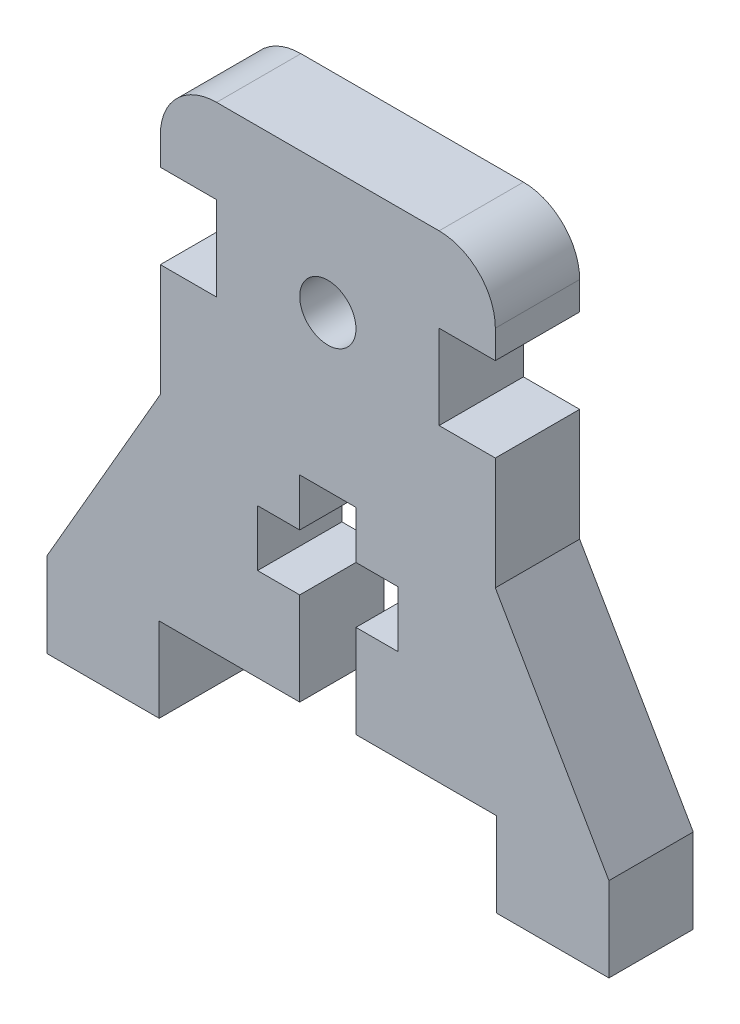
ISO-10303-21;
HEADER;
FILE_DESCRIPTION(('STEP AP214'),'2;1');
FILE_NAME('part.step','',(''),(''),'','','');
FILE_SCHEMA(('AUTOMOTIVE_DESIGN { 1 0 10303 214 1 1 1 1 }'));
ENDSEC;
DATA;
#1=APPLICATION_CONTEXT('core data for automotive mechanical design processes');
#2=APPLICATION_PROTOCOL_DEFINITION('international standard','automotive_design',2000,#1);
#3=PRODUCT_CONTEXT('',#1,'mechanical');
#4=PRODUCT('Part','Part','',(#3));
#5=PRODUCT_RELATED_PRODUCT_CATEGORY('part','',(#4));
#6=PRODUCT_DEFINITION_FORMATION('','',#4);
#7=PRODUCT_DEFINITION_CONTEXT('part definition',#1,'design');
#8=PRODUCT_DEFINITION('design','',#6,#7);
#9=PRODUCT_DEFINITION_SHAPE('','',#8);
#10=(LENGTH_UNIT() NAMED_UNIT(*) SI_UNIT(.MILLI.,.METRE.));
#11=(NAMED_UNIT(*) PLANE_ANGLE_UNIT() SI_UNIT($,.RADIAN.));
#12=(NAMED_UNIT(*) SI_UNIT($,.STERADIAN.) SOLID_ANGLE_UNIT());
#13=UNCERTAINTY_MEASURE_WITH_UNIT(LENGTH_MEASURE(1.E-05),#10,'distance_accuracy_value','');
#14=(GEOMETRIC_REPRESENTATION_CONTEXT(3) GLOBAL_UNCERTAINTY_ASSIGNED_CONTEXT((#13)) GLOBAL_UNIT_ASSIGNED_CONTEXT((#10,
#11,#12)) REPRESENTATION_CONTEXT('',''));
#15=CARTESIAN_POINT('',(0.,0.,0.));
#16=DIRECTION('',(0.,0.,1.));
#17=DIRECTION('',(1.,0.,0.));
#18=AXIS2_PLACEMENT_3D('',#15,#16,#17);
#19=CARTESIAN_POINT('',(-50.,0.,15.));
#20=DIRECTION('',(0.,1.,0.));
#21=DIRECTION('',(0.,0.,1.));
#22=AXIS2_PLACEMENT_3D('',#19,#20,#21);
#23=PLANE('',#22);
#24=DIRECTION('',(0.,0.,1.));
#25=VECTOR('',#24,1.);
#26=CARTESIAN_POINT('',(30.,0.,0.));
#27=LINE('',#26,#25);
#28=CARTESIAN_POINT('',(30.,0.,0.));
#29=VERTEX_POINT('',#28);
#30=CARTESIAN_POINT('',(30.,0.,15.));
#31=VERTEX_POINT('',#30);
#32=EDGE_CURVE('E907',#29,#31,#27,.T.);
#33=ORIENTED_EDGE('',*,*,#32,.F.);
#34=DIRECTION('',(1.,0.,0.));
#35=VECTOR('',#34,1.);
#36=CARTESIAN_POINT('',(-50.,0.,0.));
#37=LINE('',#36,#35);
#38=CARTESIAN_POINT('',(50.,0.,0.));
#39=VERTEX_POINT('',#38);
#40=EDGE_CURVE('E168',#29,#39,#37,.T.);
#41=ORIENTED_EDGE('',*,*,#40,.T.);
#42=DIRECTION('',(0.,0.,-1.));
#43=VECTOR('',#42,1.);
#44=CARTESIAN_POINT('',(50.,0.,15.));
#45=LINE('',#44,#43);
#46=CARTESIAN_POINT('',(50.,0.,15.));
#47=VERTEX_POINT('',#46);
#48=EDGE_CURVE('E254',#47,#39,#45,.T.);
#49=ORIENTED_EDGE('',*,*,#48,.F.);
#50=DIRECTION('',(1.,0.,0.));
#51=VECTOR('',#50,1.);
#52=CARTESIAN_POINT('',(-50.,0.,15.));
#53=LINE('',#52,#51);
#54=EDGE_CURVE('E104',#31,#47,#53,.T.);
#55=ORIENTED_EDGE('',*,*,#54,.F.);
#56=EDGE_LOOP('',(#33,#41,#49,#55));
#57=FACE_BOUND('',#56,.T.);
#58=ADVANCED_FACE('F80',(#57),#23,.F.);
#59=CARTESIAN_POINT('',(19.7927405783629,90.,15.));
#60=DIRECTION('',(0.,0.,1.));
#61=DIRECTION('',(1.,0.,0.));
#62=AXIS2_PLACEMENT_3D('',#59,#60,#61);
#63=PLANE('',#62);
#64=CARTESIAN_POINT('',(0.,77.5,15.));
#65=DIRECTION('',(0.,0.,1.));
#66=DIRECTION('',(1.,0.,0.));
#67=AXIS2_PLACEMENT_3D('',#64,#65,#66);
#68=CIRCLE('',#67,5.);
#69=CARTESIAN_POINT('',(5.,77.5,15.));
#70=VERTEX_POINT('',#69);
#71=EDGE_CURVE('E520',#70,#70,#68,.T.);
#72=ORIENTED_EDGE('',*,*,#71,.F.);
#73=EDGE_LOOP('',(#72));
#74=FACE_BOUND('',#73,.T.);
#75=DIRECTION('',(1.,0.,0.));
#76=VECTOR('',#75,1.);
#77=CARTESIAN_POINT('',(-30.,15.,15.));
#78=LINE('',#77,#76);
#79=CARTESIAN_POINT('',(5.,15.,15.));
#80=VERTEX_POINT('',#79);
#81=CARTESIAN_POINT('',(30.,15.,15.));
#82=VERTEX_POINT('',#81);
#83=EDGE_CURVE('E873',#80,#82,#78,.T.);
#84=ORIENTED_EDGE('',*,*,#83,.T.);
#85=DIRECTION('',(0.,-1.,0.));
#86=VECTOR('',#85,1.);
#87=CARTESIAN_POINT('',(30.,15.,15.));
#88=LINE('',#87,#86);
#89=EDGE_CURVE('E883',#82,#31,#88,.T.);
#90=ORIENTED_EDGE('',*,*,#89,.T.);
#91=ORIENTED_EDGE('',*,*,#54,.T.);
#92=DIRECTION('',(0.,1.,0.));
#93=VECTOR('',#92,1.);
#94=CARTESIAN_POINT('',(50.,0.,15.));
#95=LINE('',#94,#93);
#96=CARTESIAN_POINT('',(50.,15.,15.));
#97=VERTEX_POINT('',#96);
#98=EDGE_CURVE('E293',#47,#97,#95,.T.);
#99=ORIENTED_EDGE('',*,*,#98,.T.);
#100=DIRECTION('',(-0.500000000000005,0.866025403784436,0.));
#101=VECTOR('',#100,1.);
#102=CARTESIAN_POINT('',(50.,15.,15.));
#103=LINE('',#102,#101);
#104=CARTESIAN_POINT('',(29.7927405783629,50.,15.));
#105=VERTEX_POINT('',#104);
#106=EDGE_CURVE('E176',#97,#105,#103,.T.);
#107=ORIENTED_EDGE('',*,*,#106,.T.);
#108=DIRECTION('',(0.,1.,0.));
#109=VECTOR('',#108,1.);
#110=CARTESIAN_POINT('',(29.7927405783629,50.,15.));
#111=LINE('',#110,#109);
#112=CARTESIAN_POINT('',(29.7927405783629,70.,15.));
#113=VERTEX_POINT('',#112);
#114=EDGE_CURVE('E338',#105,#113,#111,.T.);
#115=ORIENTED_EDGE('',*,*,#114,.T.);
#116=DIRECTION('',(-1.,0.,0.));
#117=VECTOR('',#116,1.);
#118=CARTESIAN_POINT('',(29.7927405783629,70.,15.));
#119=LINE('',#118,#117);
#120=CARTESIAN_POINT('',(19.7927405783629,70.,15.));
#121=VERTEX_POINT('',#120);
#122=EDGE_CURVE('E357',#113,#121,#119,.T.);
#123=ORIENTED_EDGE('',*,*,#122,.T.);
#124=DIRECTION('',(0.,1.,0.));
#125=VECTOR('',#124,1.);
#126=CARTESIAN_POINT('',(19.7927405783629,70.,15.));
#127=LINE('',#126,#125);
#128=CARTESIAN_POINT('',(19.7927405783629,85.,15.));
#129=VERTEX_POINT('',#128);
#130=EDGE_CURVE('E354',#121,#129,#127,.T.);
#131=ORIENTED_EDGE('',*,*,#130,.T.);
#132=DIRECTION('',(1.,0.,0.));
#133=VECTOR('',#132,1.);
#134=CARTESIAN_POINT('',(19.7927405783629,85.,15.));
#135=LINE('',#134,#133);
#136=CARTESIAN_POINT('',(29.7927405783629,85.,15.));
#137=VERTEX_POINT('',#136);
#138=EDGE_CURVE('E356',#129,#137,#135,.T.);
#139=ORIENTED_EDGE('',*,*,#138,.T.);
#140=DIRECTION('',(0.,1.,0.));
#141=VECTOR('',#140,1.);
#142=CARTESIAN_POINT('',(29.7927405783629,85.,15.));
#143=LINE('',#142,#141);
#144=CARTESIAN_POINT('',(29.7927405783629,90.,15.));
#145=VERTEX_POINT('',#144);
#146=EDGE_CURVE('E359',#137,#145,#143,.T.);
#147=ORIENTED_EDGE('',*,*,#146,.T.);
#148=CARTESIAN_POINT('',(19.7927405783629,90.,15.));
#149=DIRECTION('',(0.,0.,1.));
#150=DIRECTION('',(1.,0.,0.));
#151=AXIS2_PLACEMENT_3D('',#148,#149,#150);
#152=CIRCLE('',#151,10.);
#153=CARTESIAN_POINT('',(19.7927405783629,100.,15.));
#154=VERTEX_POINT('',#153);
#155=EDGE_CURVE('E365',#145,#154,#152,.T.);
#156=ORIENTED_EDGE('',*,*,#155,.T.);
#157=DIRECTION('',(-1.,0.,0.));
#158=VECTOR('',#157,1.);
#159=CARTESIAN_POINT('',(19.7927405783629,100.,15.));
#160=LINE('',#159,#158);
#161=CARTESIAN_POINT('',(-19.7927405783629,100.,15.));
#162=VERTEX_POINT('',#161);
#163=EDGE_CURVE('E367',#154,#162,#160,.T.);
#164=ORIENTED_EDGE('',*,*,#163,.T.);
#165=CARTESIAN_POINT('',(-19.7927405783629,90.,15.));
#166=DIRECTION('',(0.,0.,1.));
#167=DIRECTION('',(-1.,0.,0.));
#168=AXIS2_PLACEMENT_3D('',#165,#166,#167);
#169=CIRCLE('',#168,10.);
#170=CARTESIAN_POINT('',(-29.7927405783629,90.,15.));
#171=VERTEX_POINT('',#170);
#172=EDGE_CURVE('E369',#162,#171,#169,.T.);
#173=ORIENTED_EDGE('',*,*,#172,.T.);
#174=DIRECTION('',(0.,-1.,0.));
#175=VECTOR('',#174,1.);
#176=CARTESIAN_POINT('',(-29.7927405783629,85.,15.));
#177=LINE('',#176,#175);
#178=CARTESIAN_POINT('',(-29.7927405783629,85.,15.));
#179=VERTEX_POINT('',#178);
#180=EDGE_CURVE('E371',#171,#179,#177,.T.);
#181=ORIENTED_EDGE('',*,*,#180,.T.);
#182=DIRECTION('',(1.,0.,0.));
#183=VECTOR('',#182,1.);
#184=CARTESIAN_POINT('',(-19.7927405783629,85.,15.));
#185=LINE('',#184,#183);
#186=CARTESIAN_POINT('',(-19.7927405783629,85.,15.));
#187=VERTEX_POINT('',#186);
#188=EDGE_CURVE('E373',#179,#187,#185,.T.);
#189=ORIENTED_EDGE('',*,*,#188,.T.);
#190=DIRECTION('',(0.,-1.,0.));
#191=VECTOR('',#190,1.);
#192=CARTESIAN_POINT('',(-19.7927405783629,70.,15.));
#193=LINE('',#192,#191);
#194=CARTESIAN_POINT('',(-19.7927405783629,70.,15.));
#195=VERTEX_POINT('',#194);
#196=EDGE_CURVE('E375',#187,#195,#193,.T.);
#197=ORIENTED_EDGE('',*,*,#196,.T.);
#198=DIRECTION('',(-1.,0.,0.));
#199=VECTOR('',#198,1.);
#200=CARTESIAN_POINT('',(-29.7927405783629,70.,15.));
#201=LINE('',#200,#199);
#202=CARTESIAN_POINT('',(-29.7927405783629,70.,15.));
#203=VERTEX_POINT('',#202);
#204=EDGE_CURVE('E377',#195,#203,#201,.T.);
#205=ORIENTED_EDGE('',*,*,#204,.T.);
#206=DIRECTION('',(0.,-1.,0.));
#207=VECTOR('',#206,1.);
#208=CARTESIAN_POINT('',(-29.7927405783629,50.,15.));
#209=LINE('',#208,#207);
#210=CARTESIAN_POINT('',(-29.7927405783629,50.,15.));
#211=VERTEX_POINT('',#210);
#212=EDGE_CURVE('E231',#203,#211,#209,.T.);
#213=ORIENTED_EDGE('',*,*,#212,.T.);
#214=DIRECTION('',(-0.500000000000004,-0.866025403784436,0.));
#215=VECTOR('',#214,1.);
#216=CARTESIAN_POINT('',(-50.,15.,15.));
#217=LINE('',#216,#215);
#218=CARTESIAN_POINT('',(-50.,15.,15.));
#219=VERTEX_POINT('',#218);
#220=EDGE_CURVE('E222',#211,#219,#217,.T.);
#221=ORIENTED_EDGE('',*,*,#220,.T.);
#222=DIRECTION('',(0.,-1.,0.));
#223=VECTOR('',#222,1.);
#224=CARTESIAN_POINT('',(-50.,0.,15.));
#225=LINE('',#224,#223);
#226=CARTESIAN_POINT('',(-50.,0.,15.));
#227=VERTEX_POINT('',#226);
#228=EDGE_CURVE('E228',#219,#227,#225,.T.);
#229=ORIENTED_EDGE('',*,*,#228,.T.);
#230=CARTESIAN_POINT('',(-30.,0.,15.));
#231=VERTEX_POINT('',#230);
#232=EDGE_CURVE('E250',#227,#231,#53,.T.);
#233=ORIENTED_EDGE('',*,*,#232,.T.);
#234=DIRECTION('',(0.,-1.,0.));
#235=VECTOR('',#234,1.);
#236=CARTESIAN_POINT('',(-30.,15.,15.));
#237=LINE('',#236,#235);
#238=CARTESIAN_POINT('',(-30.,15.,15.));
#239=VERTEX_POINT('',#238);
#240=EDGE_CURVE('E400',#239,#231,#237,.T.);
#241=ORIENTED_EDGE('',*,*,#240,.F.);
#242=CARTESIAN_POINT('',(-5.,15.,15.));
#243=VERTEX_POINT('',#242);
#244=EDGE_CURVE('E884',#239,#243,#78,.T.);
#245=ORIENTED_EDGE('',*,*,#244,.T.);
#246=DIRECTION('',(0.,-1.,0.));
#247=VECTOR('',#246,1.);
#248=CARTESIAN_POINT('',(-5.00000000000001,50.,15.));
#249=LINE('',#248,#247);
#250=CARTESIAN_POINT('',(-5.,31.5158472255241,15.));
#251=VERTEX_POINT('',#250);
#252=EDGE_CURVE('E835',#251,#243,#249,.T.);
#253=ORIENTED_EDGE('',*,*,#252,.F.);
#254=DIRECTION('',(1.,0.,0.));
#255=VECTOR('',#254,1.);
#256=CARTESIAN_POINT('',(-12.5,31.5158472255241,15.));
#257=LINE('',#256,#255);
#258=CARTESIAN_POINT('',(-12.5,31.5158472255241,15.));
#259=VERTEX_POINT('',#258);
#260=EDGE_CURVE('E852',#259,#251,#257,.T.);
#261=ORIENTED_EDGE('',*,*,#260,.F.);
#262=DIRECTION('',(0.,-1.,0.));
#263=VECTOR('',#262,1.);
#264=CARTESIAN_POINT('',(-12.5,41.5158472255241,15.));
#265=LINE('',#264,#263);
#266=CARTESIAN_POINT('',(-12.5,41.5158472255241,15.));
#267=VERTEX_POINT('',#266);
#268=EDGE_CURVE('E839',#267,#259,#265,.T.);
#269=ORIENTED_EDGE('',*,*,#268,.F.);
#270=DIRECTION('',(1.,0.,0.));
#271=VECTOR('',#270,1.);
#272=CARTESIAN_POINT('',(-12.5,41.5158472255241,15.));
#273=LINE('',#272,#271);
#274=CARTESIAN_POINT('',(-5.00000000000001,41.5158472255241,15.));
#275=VERTEX_POINT('',#274);
#276=EDGE_CURVE('E827',#267,#275,#273,.T.);
#277=ORIENTED_EDGE('',*,*,#276,.T.);
#278=CARTESIAN_POINT('',(-5.00000000000001,50.,15.));
#279=VERTEX_POINT('',#278);
#280=EDGE_CURVE('E496',#279,#275,#249,.T.);
#281=ORIENTED_EDGE('',*,*,#280,.F.);
#282=DIRECTION('',(1.,0.,0.));
#283=VECTOR('',#282,1.);
#284=CARTESIAN_POINT('',(-5.00000000000001,50.,15.));
#285=LINE('',#284,#283);
#286=CARTESIAN_POINT('',(4.99999999999999,50.,15.));
#287=VERTEX_POINT('',#286);
#288=EDGE_CURVE('E867',#279,#287,#285,.T.);
#289=ORIENTED_EDGE('',*,*,#288,.T.);
#290=DIRECTION('',(0.,-1.,0.));
#291=VECTOR('',#290,1.);
#292=CARTESIAN_POINT('',(4.99999999999999,50.,15.));
#293=LINE('',#292,#291);
#294=CARTESIAN_POINT('',(4.99999999999999,41.5158472255241,15.));
#295=VERTEX_POINT('',#294);
#296=EDGE_CURVE('E505',#287,#295,#293,.T.);
#297=ORIENTED_EDGE('',*,*,#296,.T.);
#298=CARTESIAN_POINT('',(12.5,41.5158472255241,15.));
#299=VERTEX_POINT('',#298);
#300=EDGE_CURVE('E840',#295,#299,#273,.T.);
#301=ORIENTED_EDGE('',*,*,#300,.T.);
#302=DIRECTION('',(0.,-1.,0.));
#303=VECTOR('',#302,1.);
#304=CARTESIAN_POINT('',(12.5,41.5158472255241,15.));
#305=LINE('',#304,#303);
#306=CARTESIAN_POINT('',(12.5,31.5158472255241,15.));
#307=VERTEX_POINT('',#306);
#308=EDGE_CURVE('E843',#299,#307,#305,.T.);
#309=ORIENTED_EDGE('',*,*,#308,.T.);
#310=CARTESIAN_POINT('',(5.,31.5158472255241,15.));
#311=VERTEX_POINT('',#310);
#312=EDGE_CURVE('E855',#311,#307,#257,.T.);
#313=ORIENTED_EDGE('',*,*,#312,.F.);
#314=EDGE_CURVE('E866',#311,#80,#293,.T.);
#315=ORIENTED_EDGE('',*,*,#314,.T.);
#316=EDGE_LOOP('',(#84,#90,#91,#99,#107,#115,#123,#131,#139,#147,#156,#164,#173,#181,#189,#197,
#205,#213,#221,#229,#233,#241,#245,#253,#261,#269,#277,#281,#289,#297,#301,#309,#313,#315));
#317=FACE_BOUND('',#316,.T.);
#318=ADVANCED_FACE('F225',(#74,#317),#63,.T.);
#319=CARTESIAN_POINT('',(19.7927405783629,90.,0.));
#320=DIRECTION('',(0.,0.,1.));
#321=DIRECTION('',(1.,0.,0.));
#322=AXIS2_PLACEMENT_3D('',#319,#320,#321);
#323=PLANE('',#322);
#324=CARTESIAN_POINT('',(0.,77.5,0.));
#325=DIRECTION('',(0.,0.,1.));
#326=DIRECTION('',(1.,0.,0.));
#327=AXIS2_PLACEMENT_3D('',#324,#325,#326);
#328=CIRCLE('',#327,5.);
#329=CARTESIAN_POINT('',(5.,77.5,0.));
#330=VERTEX_POINT('',#329);
#331=EDGE_CURVE('E259',#330,#330,#328,.T.);
#332=ORIENTED_EDGE('',*,*,#331,.T.);
#333=EDGE_LOOP('',(#332));
#334=FACE_BOUND('',#333,.T.);
#335=DIRECTION('',(0.,-1.,0.));
#336=VECTOR('',#335,1.);
#337=CARTESIAN_POINT('',(30.,15.,0.));
#338=LINE('',#337,#336);
#339=CARTESIAN_POINT('',(30.,15.,0.));
#340=VERTEX_POINT('',#339);
#341=EDGE_CURVE('E896',#340,#29,#338,.T.);
#342=ORIENTED_EDGE('',*,*,#341,.F.);
#343=DIRECTION('',(1.,0.,0.));
#344=VECTOR('',#343,1.);
#345=CARTESIAN_POINT('',(-30.,15.,0.));
#346=LINE('',#345,#344);
#347=CARTESIAN_POINT('',(5.,15.,0.));
#348=VERTEX_POINT('',#347);
#349=EDGE_CURVE('E895',#348,#340,#346,.T.);
#350=ORIENTED_EDGE('',*,*,#349,.F.);
#351=DIRECTION('',(0.,-1.,0.));
#352=VECTOR('',#351,1.);
#353=CARTESIAN_POINT('',(4.99999999999999,50.,0.));
#354=LINE('',#353,#352);
#355=CARTESIAN_POINT('',(5.,31.5158472255241,0.));
#356=VERTEX_POINT('',#355);
#357=EDGE_CURVE('E497',#356,#348,#354,.T.);
#358=ORIENTED_EDGE('',*,*,#357,.F.);
#359=DIRECTION('',(1.,0.,0.));
#360=VECTOR('',#359,1.);
#361=CARTESIAN_POINT('',(-12.5,31.5158472255241,0.));
#362=LINE('',#361,#360);
#363=CARTESIAN_POINT('',(12.5,31.5158472255241,0.));
#364=VERTEX_POINT('',#363);
#365=EDGE_CURVE('E844',#356,#364,#362,.T.);
#366=ORIENTED_EDGE('',*,*,#365,.T.);
#367=DIRECTION('',(0.,-1.,0.));
#368=VECTOR('',#367,1.);
#369=CARTESIAN_POINT('',(12.5,41.5158472255241,0.));
#370=LINE('',#369,#368);
#371=CARTESIAN_POINT('',(12.5,41.5158472255241,0.));
#372=VERTEX_POINT('',#371);
#373=EDGE_CURVE('E860',#372,#364,#370,.T.);
#374=ORIENTED_EDGE('',*,*,#373,.F.);
#375=DIRECTION('',(1.,0.,0.));
#376=VECTOR('',#375,1.);
#377=CARTESIAN_POINT('',(-12.5,41.5158472255241,0.));
#378=LINE('',#377,#376);
#379=CARTESIAN_POINT('',(4.99999999999999,41.5158472255241,0.));
#380=VERTEX_POINT('',#379);
#381=EDGE_CURVE('E509',#380,#372,#378,.T.);
#382=ORIENTED_EDGE('',*,*,#381,.F.);
#383=CARTESIAN_POINT('',(4.99999999999999,50.,0.));
#384=VERTEX_POINT('',#383);
#385=EDGE_CURVE('E502',#384,#380,#354,.T.);
#386=ORIENTED_EDGE('',*,*,#385,.F.);
#387=DIRECTION('',(1.,0.,0.));
#388=VECTOR('',#387,1.);
#389=CARTESIAN_POINT('',(-5.00000000000001,50.,0.));
#390=LINE('',#389,#388);
#391=CARTESIAN_POINT('',(-5.00000000000001,50.,0.));
#392=VERTEX_POINT('',#391);
#393=EDGE_CURVE('E489',#392,#384,#390,.T.);
#394=ORIENTED_EDGE('',*,*,#393,.F.);
#395=DIRECTION('',(0.,-1.,0.));
#396=VECTOR('',#395,1.);
#397=CARTESIAN_POINT('',(-5.00000000000001,50.,0.));
#398=LINE('',#397,#396);
#399=CARTESIAN_POINT('',(-5.00000000000001,41.5158472255241,0.));
#400=VERTEX_POINT('',#399);
#401=EDGE_CURVE('E514',#392,#400,#398,.T.);
#402=ORIENTED_EDGE('',*,*,#401,.T.);
#403=CARTESIAN_POINT('',(-12.5,41.5158472255241,0.));
#404=VERTEX_POINT('',#403);
#405=EDGE_CURVE('E830',#404,#400,#378,.T.);
#406=ORIENTED_EDGE('',*,*,#405,.F.);
#407=DIRECTION('',(0.,-1.,0.));
#408=VECTOR('',#407,1.);
#409=CARTESIAN_POINT('',(-12.5,41.5158472255241,0.));
#410=LINE('',#409,#408);
#411=CARTESIAN_POINT('',(-12.5,31.5158472255241,0.));
#412=VERTEX_POINT('',#411);
#413=EDGE_CURVE('E95',#404,#412,#410,.T.);
#414=ORIENTED_EDGE('',*,*,#413,.T.);
#415=CARTESIAN_POINT('',(-5.,31.5158472255241,0.));
#416=VERTEX_POINT('',#415);
#417=EDGE_CURVE('E862',#412,#416,#362,.T.);
#418=ORIENTED_EDGE('',*,*,#417,.T.);
#419=CARTESIAN_POINT('',(-5.,15.,0.));
#420=VERTEX_POINT('',#419);
#421=EDGE_CURVE('E510',#416,#420,#398,.T.);
#422=ORIENTED_EDGE('',*,*,#421,.T.);
#423=CARTESIAN_POINT('',(-30.,15.,0.));
#424=VERTEX_POINT('',#423);
#425=EDGE_CURVE('E892',#424,#420,#346,.T.);
#426=ORIENTED_EDGE('',*,*,#425,.F.);
#427=DIRECTION('',(0.,-1.,0.));
#428=VECTOR('',#427,1.);
#429=CARTESIAN_POINT('',(-30.,15.,0.));
#430=LINE('',#429,#428);
#431=CARTESIAN_POINT('',(-30.,0.,0.));
#432=VERTEX_POINT('',#431);
#433=EDGE_CURVE('E887',#424,#432,#430,.T.);
#434=ORIENTED_EDGE('',*,*,#433,.T.);
#435=CARTESIAN_POINT('',(-50.,0.,0.));
#436=VERTEX_POINT('',#435);
#437=EDGE_CURVE('E290',#436,#432,#37,.T.);
#438=ORIENTED_EDGE('',*,*,#437,.F.);
#439=DIRECTION('',(0.,-1.,0.));
#440=VECTOR('',#439,1.);
#441=CARTESIAN_POINT('',(-50.,0.,0.));
#442=LINE('',#441,#440);
#443=CARTESIAN_POINT('',(-50.,15.,0.));
#444=VERTEX_POINT('',#443);
#445=EDGE_CURVE('E288',#444,#436,#442,.T.);
#446=ORIENTED_EDGE('',*,*,#445,.F.);
#447=DIRECTION('',(-0.500000000000004,-0.866025403784436,0.));
#448=VECTOR('',#447,1.);
#449=CARTESIAN_POINT('',(-50.,15.,0.));
#450=LINE('',#449,#448);
#451=CARTESIAN_POINT('',(-29.7927405783629,50.,0.));
#452=VERTEX_POINT('',#451);
#453=EDGE_CURVE('E240',#452,#444,#450,.T.);
#454=ORIENTED_EDGE('',*,*,#453,.F.);
#455=DIRECTION('',(0.,-1.,0.));
#456=VECTOR('',#455,1.);
#457=CARTESIAN_POINT('',(-29.7927405783629,50.,0.));
#458=LINE('',#457,#456);
#459=CARTESIAN_POINT('',(-29.7927405783629,70.,0.));
#460=VERTEX_POINT('',#459);
#461=EDGE_CURVE('E285',#460,#452,#458,.T.);
#462=ORIENTED_EDGE('',*,*,#461,.F.);
#463=DIRECTION('',(-1.,0.,0.));
#464=VECTOR('',#463,1.);
#465=CARTESIAN_POINT('',(-29.7927405783629,70.,0.));
#466=LINE('',#465,#464);
#467=CARTESIAN_POINT('',(-19.7927405783629,70.,0.));
#468=VERTEX_POINT('',#467);
#469=EDGE_CURVE('E283',#468,#460,#466,.T.);
#470=ORIENTED_EDGE('',*,*,#469,.F.);
#471=DIRECTION('',(0.,-1.,0.));
#472=VECTOR('',#471,1.);
#473=CARTESIAN_POINT('',(-19.7927405783629,70.,0.));
#474=LINE('',#473,#472);
#475=CARTESIAN_POINT('',(-19.7927405783629,85.,0.));
#476=VERTEX_POINT('',#475);
#477=EDGE_CURVE('E281',#476,#468,#474,.T.);
#478=ORIENTED_EDGE('',*,*,#477,.F.);
#479=DIRECTION('',(1.,0.,0.));
#480=VECTOR('',#479,1.);
#481=CARTESIAN_POINT('',(-19.7927405783629,85.,0.));
#482=LINE('',#481,#480);
#483=CARTESIAN_POINT('',(-29.7927405783629,85.,0.));
#484=VERTEX_POINT('',#483);
#485=EDGE_CURVE('E279',#484,#476,#482,.T.);
#486=ORIENTED_EDGE('',*,*,#485,.F.);
#487=DIRECTION('',(0.,-1.,0.));
#488=VECTOR('',#487,1.);
#489=CARTESIAN_POINT('',(-29.7927405783629,85.,0.));
#490=LINE('',#489,#488);
#491=CARTESIAN_POINT('',(-29.7927405783629,90.,0.));
#492=VERTEX_POINT('',#491);
#493=EDGE_CURVE('E277',#492,#484,#490,.T.);
#494=ORIENTED_EDGE('',*,*,#493,.F.);
#495=CARTESIAN_POINT('',(-19.7927405783629,90.,0.));
#496=DIRECTION('',(0.,0.,1.));
#497=DIRECTION('',(-1.,0.,0.));
#498=AXIS2_PLACEMENT_3D('',#495,#496,#497);
#499=CIRCLE('',#498,10.);
#500=CARTESIAN_POINT('',(-19.7927405783629,100.,0.));
#501=VERTEX_POINT('',#500);
#502=EDGE_CURVE('E275',#501,#492,#499,.T.);
#503=ORIENTED_EDGE('',*,*,#502,.F.);
#504=DIRECTION('',(-1.,0.,0.));
#505=VECTOR('',#504,1.);
#506=CARTESIAN_POINT('',(19.7927405783629,100.,0.));
#507=LINE('',#506,#505);
#508=CARTESIAN_POINT('',(19.7927405783629,100.,0.));
#509=VERTEX_POINT('',#508);
#510=EDGE_CURVE('E273',#509,#501,#507,.T.);
#511=ORIENTED_EDGE('',*,*,#510,.F.);
#512=CARTESIAN_POINT('',(19.7927405783629,90.,0.));
#513=DIRECTION('',(0.,0.,1.));
#514=DIRECTION('',(1.,0.,0.));
#515=AXIS2_PLACEMENT_3D('',#512,#513,#514);
#516=CIRCLE('',#515,10.);
#517=CARTESIAN_POINT('',(29.7927405783629,90.,0.));
#518=VERTEX_POINT('',#517);
#519=EDGE_CURVE('E271',#518,#509,#516,.T.);
#520=ORIENTED_EDGE('',*,*,#519,.F.);
#521=DIRECTION('',(0.,1.,0.));
#522=VECTOR('',#521,1.);
#523=CARTESIAN_POINT('',(29.7927405783629,85.,0.));
#524=LINE('',#523,#522);
#525=CARTESIAN_POINT('',(29.7927405783629,85.,0.));
#526=VERTEX_POINT('',#525);
#527=EDGE_CURVE('E269',#526,#518,#524,.T.);
#528=ORIENTED_EDGE('',*,*,#527,.F.);
#529=DIRECTION('',(1.,0.,0.));
#530=VECTOR('',#529,1.);
#531=CARTESIAN_POINT('',(19.7927405783629,85.,0.));
#532=LINE('',#531,#530);
#533=CARTESIAN_POINT('',(19.7927405783629,85.,0.));
#534=VERTEX_POINT('',#533);
#535=EDGE_CURVE('E267',#534,#526,#532,.T.);
#536=ORIENTED_EDGE('',*,*,#535,.F.);
#537=DIRECTION('',(0.,1.,0.));
#538=VECTOR('',#537,1.);
#539=CARTESIAN_POINT('',(19.7927405783629,70.,0.));
#540=LINE('',#539,#538);
#541=CARTESIAN_POINT('',(19.7927405783629,70.,0.));
#542=VERTEX_POINT('',#541);
#543=EDGE_CURVE('E265',#542,#534,#540,.T.);
#544=ORIENTED_EDGE('',*,*,#543,.F.);
#545=DIRECTION('',(-1.,0.,0.));
#546=VECTOR('',#545,1.);
#547=CARTESIAN_POINT('',(29.7927405783629,70.,0.));
#548=LINE('',#547,#546);
#549=CARTESIAN_POINT('',(29.7927405783629,70.,0.));
#550=VERTEX_POINT('',#549);
#551=EDGE_CURVE('E263',#550,#542,#548,.T.);
#552=ORIENTED_EDGE('',*,*,#551,.F.);
#553=DIRECTION('',(0.,1.,0.));
#554=VECTOR('',#553,1.);
#555=CARTESIAN_POINT('',(29.7927405783629,50.,0.));
#556=LINE('',#555,#554);
#557=CARTESIAN_POINT('',(29.7927405783629,50.,0.));
#558=VERTEX_POINT('',#557);
#559=EDGE_CURVE('E261',#558,#550,#556,.T.);
#560=ORIENTED_EDGE('',*,*,#559,.F.);
#561=DIRECTION('',(-0.500000000000005,0.866025403784436,0.));
#562=VECTOR('',#561,1.);
#563=CARTESIAN_POINT('',(50.,15.,0.));
#564=LINE('',#563,#562);
#565=CARTESIAN_POINT('',(50.,15.,0.));
#566=VERTEX_POINT('',#565);
#567=EDGE_CURVE('E258',#566,#558,#564,.T.);
#568=ORIENTED_EDGE('',*,*,#567,.F.);
#569=DIRECTION('',(0.,1.,0.));
#570=VECTOR('',#569,1.);
#571=CARTESIAN_POINT('',(50.,0.,0.));
#572=LINE('',#571,#570);
#573=EDGE_CURVE('E255',#39,#566,#572,.T.);
#574=ORIENTED_EDGE('',*,*,#573,.F.);
#575=ORIENTED_EDGE('',*,*,#40,.F.);
#576=EDGE_LOOP('',(#342,#350,#358,#366,#374,#382,#386,#394,#402,#406,#414,#418,#422,#426,#434,
#438,#446,#454,#462,#470,#478,#486,#494,#503,#511,#520,#528,#536,#544,#552,#560,#568,#574,#575));
#577=FACE_BOUND('',#576,.T.);
#578=ADVANCED_FACE('F342',(#334,#577),#323,.F.);
#579=CARTESIAN_POINT('',(50.,0.,15.));
#580=DIRECTION('',(-1.,0.,0.));
#581=DIRECTION('',(0.,0.,1.));
#582=AXIS2_PLACEMENT_3D('',#579,#580,#581);
#583=PLANE('',#582);
#584=ORIENTED_EDGE('',*,*,#573,.T.);
#585=DIRECTION('',(0.,0.,-1.));
#586=VECTOR('',#585,1.);
#587=CARTESIAN_POINT('',(50.,15.,15.));
#588=LINE('',#587,#586);
#589=EDGE_CURVE('E12',#97,#566,#588,.T.);
#590=ORIENTED_EDGE('',*,*,#589,.F.);
#591=ORIENTED_EDGE('',*,*,#98,.F.);
#592=ORIENTED_EDGE('',*,*,#48,.T.);
#593=EDGE_LOOP('',(#584,#590,#591,#592));
#594=FACE_BOUND('',#593,.T.);
#595=ADVANCED_FACE('F82',(#594),#583,.F.);
#596=CARTESIAN_POINT('',(50.,15.,15.));
#597=DIRECTION('',(-0.866025403784436,-0.500000000000005,0.));
#598=DIRECTION('',(0.500000000000005,-0.866025403784436,0.));
#599=AXIS2_PLACEMENT_3D('',#596,#597,#598);
#600=PLANE('',#599);
#601=ORIENTED_EDGE('',*,*,#567,.T.);
#602=DIRECTION('',(0.,0.,-1.));
#603=VECTOR('',#602,1.);
#604=CARTESIAN_POINT('',(29.7927405783629,50.,15.));
#605=LINE('',#604,#603);
#606=EDGE_CURVE('E88',#105,#558,#605,.T.);
#607=ORIENTED_EDGE('',*,*,#606,.F.);
#608=ORIENTED_EDGE('',*,*,#106,.F.);
#609=ORIENTED_EDGE('',*,*,#589,.T.);
#610=EDGE_LOOP('',(#601,#607,#608,#609));
#611=FACE_BOUND('',#610,.T.);
#612=ADVANCED_FACE('F527',(#611),#600,.F.);
#613=CARTESIAN_POINT('',(29.7927405783629,50.,15.));
#614=DIRECTION('',(-1.,0.,0.));
#615=DIRECTION('',(0.,-1.,0.));
#616=AXIS2_PLACEMENT_3D('',#613,#614,#615);
#617=PLANE('',#616);
#618=ORIENTED_EDGE('',*,*,#559,.T.);
#619=DIRECTION('',(0.,0.,-1.));
#620=VECTOR('',#619,1.);
#621=CARTESIAN_POINT('',(29.7927405783629,70.,15.));
#622=LINE('',#621,#620);
#623=EDGE_CURVE('E330',#113,#550,#622,.T.);
#624=ORIENTED_EDGE('',*,*,#623,.F.);
#625=ORIENTED_EDGE('',*,*,#114,.F.);
#626=ORIENTED_EDGE('',*,*,#606,.T.);
#627=EDGE_LOOP('',(#618,#624,#625,#626));
#628=FACE_BOUND('',#627,.T.);
#629=ADVANCED_FACE('F336',(#628),#617,.F.);
#630=CARTESIAN_POINT('',(29.7927405783629,70.,15.));
#631=DIRECTION('',(0.,-1.,0.));
#632=DIRECTION('',(1.,0.,0.));
#633=AXIS2_PLACEMENT_3D('',#630,#631,#632);
#634=PLANE('',#633);
#635=ORIENTED_EDGE('',*,*,#551,.T.);
#636=DIRECTION('',(0.,0.,-1.));
#637=VECTOR('',#636,1.);
#638=CARTESIAN_POINT('',(19.7927405783629,70.,15.));
#639=LINE('',#638,#637);
#640=EDGE_CURVE('E327',#121,#542,#639,.T.);
#641=ORIENTED_EDGE('',*,*,#640,.F.);
#642=ORIENTED_EDGE('',*,*,#122,.F.);
#643=ORIENTED_EDGE('',*,*,#623,.T.);
#644=EDGE_LOOP('',(#635,#641,#642,#643));
#645=FACE_BOUND('',#644,.T.);
#646=ADVANCED_FACE('F348',(#645),#634,.F.);
#647=CARTESIAN_POINT('',(19.7927405783629,70.,15.));
#648=DIRECTION('',(-1.,0.,0.));
#649=DIRECTION('',(0.,0.,1.));
#650=AXIS2_PLACEMENT_3D('',#647,#648,#649);
#651=PLANE('',#650);
#652=ORIENTED_EDGE('',*,*,#543,.T.);
#653=DIRECTION('',(0.,0.,-1.));
#654=VECTOR('',#653,1.);
#655=CARTESIAN_POINT('',(19.7927405783629,85.,15.));
#656=LINE('',#655,#654);
#657=EDGE_CURVE('E324',#129,#534,#656,.T.);
#658=ORIENTED_EDGE('',*,*,#657,.F.);
#659=ORIENTED_EDGE('',*,*,#130,.F.);
#660=ORIENTED_EDGE('',*,*,#640,.T.);
#661=EDGE_LOOP('',(#652,#658,#659,#660));
#662=FACE_BOUND('',#661,.T.);
#663=ADVANCED_FACE('F352',(#662),#651,.F.);
#664=CARTESIAN_POINT('',(19.7927405783629,85.,15.));
#665=DIRECTION('',(0.,1.,0.));
#666=DIRECTION('',(0.,0.,1.));
#667=AXIS2_PLACEMENT_3D('',#664,#665,#666);
#668=PLANE('',#667);
#669=ORIENTED_EDGE('',*,*,#535,.T.);
#670=DIRECTION('',(0.,0.,-1.));
#671=VECTOR('',#670,1.);
#672=CARTESIAN_POINT('',(29.7927405783629,85.,15.));
#673=LINE('',#672,#671);
#674=EDGE_CURVE('E321',#137,#526,#673,.T.);
#675=ORIENTED_EDGE('',*,*,#674,.F.);
#676=ORIENTED_EDGE('',*,*,#138,.F.);
#677=ORIENTED_EDGE('',*,*,#657,.T.);
#678=EDGE_LOOP('',(#669,#675,#676,#677));
#679=FACE_BOUND('',#678,.T.);
#680=ADVANCED_FACE('F587',(#679),#668,.F.);
#681=CARTESIAN_POINT('',(29.7927405783629,85.,15.));
#682=DIRECTION('',(-1.,0.,0.));
#683=DIRECTION('',(0.,-1.,0.));
#684=AXIS2_PLACEMENT_3D('',#681,#682,#683);
#685=PLANE('',#684);
#686=ORIENTED_EDGE('',*,*,#527,.T.);
#687=DIRECTION('',(0.,0.,-1.));
#688=VECTOR('',#687,1.);
#689=CARTESIAN_POINT('',(29.7927405783629,90.,15.));
#690=LINE('',#689,#688);
#691=EDGE_CURVE('E318',#145,#518,#690,.T.);
#692=ORIENTED_EDGE('',*,*,#691,.F.);
#693=ORIENTED_EDGE('',*,*,#146,.F.);
#694=ORIENTED_EDGE('',*,*,#674,.T.);
#695=EDGE_LOOP('',(#686,#692,#693,#694));
#696=FACE_BOUND('',#695,.T.);
#697=ADVANCED_FACE('F583',(#696),#685,.F.);
#698=CARTESIAN_POINT('',(19.7927405783629,90.,15.));
#699=DIRECTION('',(0.,0.,-1.));
#700=DIRECTION('',(-1.,0.,0.));
#701=AXIS2_PLACEMENT_3D('',#698,#699,#700);
#702=CYLINDRICAL_SURFACE('',#701,10.);
#703=ORIENTED_EDGE('',*,*,#519,.T.);
#704=DIRECTION('',(0.,0.,-1.));
#705=VECTOR('',#704,1.);
#706=CARTESIAN_POINT('',(19.7927405783629,100.,15.));
#707=LINE('',#706,#705);
#708=EDGE_CURVE('E315',#154,#509,#707,.T.);
#709=ORIENTED_EDGE('',*,*,#708,.F.);
#710=ORIENTED_EDGE('',*,*,#155,.F.);
#711=ORIENTED_EDGE('',*,*,#691,.T.);
#712=EDGE_LOOP('',(#703,#709,#710,#711));
#713=FACE_BOUND('',#712,.T.);
#714=ADVANCED_FACE('F579',(#713),#702,.T.);
#715=CARTESIAN_POINT('',(19.7927405783629,100.,15.));
#716=DIRECTION('',(0.,-1.,0.));
#717=DIRECTION('',(0.,0.,-1.));
#718=AXIS2_PLACEMENT_3D('',#715,#716,#717);
#719=PLANE('',#718);
#720=ORIENTED_EDGE('',*,*,#510,.T.);
#721=DIRECTION('',(0.,0.,-1.));
#722=VECTOR('',#721,1.);
#723=CARTESIAN_POINT('',(-19.7927405783629,100.,15.));
#724=LINE('',#723,#722);
#725=EDGE_CURVE('E312',#162,#501,#724,.T.);
#726=ORIENTED_EDGE('',*,*,#725,.F.);
#727=ORIENTED_EDGE('',*,*,#163,.F.);
#728=ORIENTED_EDGE('',*,*,#708,.T.);
#729=EDGE_LOOP('',(#720,#726,#727,#728));
#730=FACE_BOUND('',#729,.T.);
#731=ADVANCED_FACE('F575',(#730),#719,.F.);
#732=CARTESIAN_POINT('',(-19.7927405783629,90.,15.));
#733=DIRECTION('',(0.,0.,-1.));
#734=DIRECTION('',(-1.,0.,0.));
#735=AXIS2_PLACEMENT_3D('',#732,#733,#734);
#736=CYLINDRICAL_SURFACE('',#735,10.);
#737=ORIENTED_EDGE('',*,*,#502,.T.);
#738=DIRECTION('',(0.,0.,-1.));
#739=VECTOR('',#738,1.);
#740=CARTESIAN_POINT('',(-29.7927405783629,90.,15.));
#741=LINE('',#740,#739);
#742=EDGE_CURVE('E309',#171,#492,#741,.T.);
#743=ORIENTED_EDGE('',*,*,#742,.F.);
#744=ORIENTED_EDGE('',*,*,#172,.F.);
#745=ORIENTED_EDGE('',*,*,#725,.T.);
#746=EDGE_LOOP('',(#737,#743,#744,#745));
#747=FACE_BOUND('',#746,.T.);
#748=ADVANCED_FACE('F571',(#747),#736,.T.);
#749=CARTESIAN_POINT('',(-29.7927405783629,85.,15.));
#750=DIRECTION('',(1.,0.,0.));
#751=DIRECTION('',(0.,1.,0.));
#752=AXIS2_PLACEMENT_3D('',#749,#750,#751);
#753=PLANE('',#752);
#754=ORIENTED_EDGE('',*,*,#493,.T.);
#755=DIRECTION('',(0.,0.,-1.));
#756=VECTOR('',#755,1.);
#757=CARTESIAN_POINT('',(-29.7927405783629,85.,15.));
#758=LINE('',#757,#756);
#759=EDGE_CURVE('E306',#179,#484,#758,.T.);
#760=ORIENTED_EDGE('',*,*,#759,.F.);
#761=ORIENTED_EDGE('',*,*,#180,.F.);
#762=ORIENTED_EDGE('',*,*,#742,.T.);
#763=EDGE_LOOP('',(#754,#760,#761,#762));
#764=FACE_BOUND('',#763,.T.);
#765=ADVANCED_FACE('F567',(#764),#753,.F.);
#766=CARTESIAN_POINT('',(-19.7927405783629,85.,15.));
#767=DIRECTION('',(0.,1.,0.));
#768=DIRECTION('',(0.,0.,1.));
#769=AXIS2_PLACEMENT_3D('',#766,#767,#768);
#770=PLANE('',#769);
#771=ORIENTED_EDGE('',*,*,#485,.T.);
#772=DIRECTION('',(0.,0.,-1.));
#773=VECTOR('',#772,1.);
#774=CARTESIAN_POINT('',(-19.7927405783629,85.,15.));
#775=LINE('',#774,#773);
#776=EDGE_CURVE('E303',#187,#476,#775,.T.);
#777=ORIENTED_EDGE('',*,*,#776,.F.);
#778=ORIENTED_EDGE('',*,*,#188,.F.);
#779=ORIENTED_EDGE('',*,*,#759,.T.);
#780=EDGE_LOOP('',(#771,#777,#778,#779));
#781=FACE_BOUND('',#780,.T.);
#782=ADVANCED_FACE('F563',(#781),#770,.F.);
#783=CARTESIAN_POINT('',(-19.7927405783629,70.,15.));
#784=DIRECTION('',(1.,0.,0.));
#785=DIRECTION('',(0.,0.,-1.));
#786=AXIS2_PLACEMENT_3D('',#783,#784,#785);
#787=PLANE('',#786);
#788=ORIENTED_EDGE('',*,*,#477,.T.);
#789=DIRECTION('',(0.,0.,-1.));
#790=VECTOR('',#789,1.);
#791=CARTESIAN_POINT('',(-19.7927405783629,70.,15.));
#792=LINE('',#791,#790);
#793=EDGE_CURVE('E300',#195,#468,#792,.T.);
#794=ORIENTED_EDGE('',*,*,#793,.F.);
#795=ORIENTED_EDGE('',*,*,#196,.F.);
#796=ORIENTED_EDGE('',*,*,#776,.T.);
#797=EDGE_LOOP('',(#788,#794,#795,#796));
#798=FACE_BOUND('',#797,.T.);
#799=ADVANCED_FACE('F560',(#798),#787,.F.);
#800=CARTESIAN_POINT('',(-29.7927405783629,70.,15.));
#801=DIRECTION('',(0.,-1.,0.));
#802=DIRECTION('',(1.,0.,0.));
#803=AXIS2_PLACEMENT_3D('',#800,#801,#802);
#804=PLANE('',#803);
#805=ORIENTED_EDGE('',*,*,#469,.T.);
#806=DIRECTION('',(0.,0.,-1.));
#807=VECTOR('',#806,1.);
#808=CARTESIAN_POINT('',(-29.7927405783629,70.,15.));
#809=LINE('',#808,#807);
#810=EDGE_CURVE('E297',#203,#460,#809,.T.);
#811=ORIENTED_EDGE('',*,*,#810,.F.);
#812=ORIENTED_EDGE('',*,*,#204,.F.);
#813=ORIENTED_EDGE('',*,*,#793,.T.);
#814=EDGE_LOOP('',(#805,#811,#812,#813));
#815=FACE_BOUND('',#814,.T.);
#816=ADVANCED_FACE('F383',(#815),#804,.F.);
#817=CARTESIAN_POINT('',(-29.7927405783629,50.,15.));
#818=DIRECTION('',(1.,0.,0.));
#819=DIRECTION('',(0.,1.,0.));
#820=AXIS2_PLACEMENT_3D('',#817,#818,#819);
#821=PLANE('',#820);
#822=ORIENTED_EDGE('',*,*,#461,.T.);
#823=DIRECTION('',(0.,0.,-1.));
#824=VECTOR('',#823,1.);
#825=CARTESIAN_POINT('',(-29.7927405783629,50.,15.));
#826=LINE('',#825,#824);
#827=EDGE_CURVE('E243',#211,#452,#826,.T.);
#828=ORIENTED_EDGE('',*,*,#827,.F.);
#829=ORIENTED_EDGE('',*,*,#212,.F.);
#830=ORIENTED_EDGE('',*,*,#810,.T.);
#831=EDGE_LOOP('',(#822,#828,#829,#830));
#832=FACE_BOUND('',#831,.T.);
#833=ADVANCED_FACE('F387',(#832),#821,.F.);
#834=CARTESIAN_POINT('',(-50.,15.,15.));
#835=DIRECTION('',(0.866025403784436,-0.500000000000004,0.));
#836=DIRECTION('',(0.500000000000004,0.866025403784436,0.));
#837=AXIS2_PLACEMENT_3D('',#834,#835,#836);
#838=PLANE('',#837);
#839=ORIENTED_EDGE('',*,*,#453,.T.);
#840=DIRECTION('',(0.,0.,-1.));
#841=VECTOR('',#840,1.);
#842=CARTESIAN_POINT('',(-50.,15.,15.));
#843=LINE('',#842,#841);
#844=EDGE_CURVE('E237',#219,#444,#843,.T.);
#845=ORIENTED_EDGE('',*,*,#844,.F.);
#846=ORIENTED_EDGE('',*,*,#220,.F.);
#847=ORIENTED_EDGE('',*,*,#827,.T.);
#848=EDGE_LOOP('',(#839,#845,#846,#847));
#849=FACE_BOUND('',#848,.T.);
#850=ADVANCED_FACE('F238',(#849),#838,.F.);
#851=CARTESIAN_POINT('',(-50.,0.,15.));
#852=DIRECTION('',(1.,0.,0.));
#853=DIRECTION('',(0.,0.,-1.));
#854=AXIS2_PLACEMENT_3D('',#851,#852,#853);
#855=PLANE('',#854);
#856=ORIENTED_EDGE('',*,*,#445,.T.);
#857=DIRECTION('',(0.,0.,-1.));
#858=VECTOR('',#857,1.);
#859=CARTESIAN_POINT('',(-50.,0.,15.));
#860=LINE('',#859,#858);
#861=EDGE_CURVE('E244',#227,#436,#860,.T.);
#862=ORIENTED_EDGE('',*,*,#861,.F.);
#863=ORIENTED_EDGE('',*,*,#228,.F.);
#864=ORIENTED_EDGE('',*,*,#844,.T.);
#865=EDGE_LOOP('',(#856,#862,#863,#864));
#866=FACE_BOUND('',#865,.T.);
#867=ADVANCED_FACE('F246',(#866),#855,.F.);
#868=ORIENTED_EDGE('',*,*,#437,.T.);
#869=DIRECTION('',(0.,0.,1.));
#870=VECTOR('',#869,1.);
#871=CARTESIAN_POINT('',(-30.,0.,0.));
#872=LINE('',#871,#870);
#873=EDGE_CURVE('E395',#432,#231,#872,.T.);
#874=ORIENTED_EDGE('',*,*,#873,.T.);
#875=ORIENTED_EDGE('',*,*,#232,.F.);
#876=ORIENTED_EDGE('',*,*,#861,.T.);
#877=EDGE_LOOP('',(#868,#874,#875,#876));
#878=FACE_BOUND('',#877,.T.);
#879=ADVANCED_FACE('F391',(#878),#23,.F.);
#880=CARTESIAN_POINT('',(0.,77.5,0.));
#881=DIRECTION('',(0.,0.,1.));
#882=DIRECTION('',(1.,0.,0.));
#883=AXIS2_PLACEMENT_3D('',#880,#881,#882);
#884=CYLINDRICAL_SURFACE('',#883,5.);
#885=ORIENTED_EDGE('',*,*,#331,.F.);
#886=EDGE_LOOP('',(#885));
#887=FACE_BOUND('',#886,.T.);
#888=ORIENTED_EDGE('',*,*,#71,.T.);
#889=EDGE_LOOP('',(#888));
#890=FACE_BOUND('',#889,.T.);
#891=ADVANCED_FACE('F544',(#887,#890),#884,.F.);
#892=CARTESIAN_POINT('',(-5.00000000000001,50.,0.));
#893=DIRECTION('',(0.,-1.,0.));
#894=DIRECTION('',(0.,0.,-1.));
#895=AXIS2_PLACEMENT_3D('',#892,#893,#894);
#896=PLANE('',#895);
#897=ORIENTED_EDGE('',*,*,#288,.F.);
#898=DIRECTION('',(0.,0.,1.));
#899=VECTOR('',#898,1.);
#900=CARTESIAN_POINT('',(-5.00000000000001,50.,0.));
#901=LINE('',#900,#899);
#902=EDGE_CURVE('E485',#392,#279,#901,.T.);
#903=ORIENTED_EDGE('',*,*,#902,.F.);
#904=ORIENTED_EDGE('',*,*,#393,.T.);
#905=DIRECTION('',(0.,0.,1.));
#906=VECTOR('',#905,1.);
#907=CARTESIAN_POINT('',(4.99999999999999,50.,0.));
#908=LINE('',#907,#906);
#909=EDGE_CURVE('E492',#384,#287,#908,.T.);
#910=ORIENTED_EDGE('',*,*,#909,.T.);
#911=EDGE_LOOP('',(#897,#903,#904,#910));
#912=FACE_BOUND('',#911,.T.);
#913=ADVANCED_FACE('F491',(#912),#896,.T.);
#914=CARTESIAN_POINT('',(4.99999999999999,50.,0.));
#915=DIRECTION('',(-1.,0.,0.));
#916=DIRECTION('',(0.,-1.,0.));
#917=AXIS2_PLACEMENT_3D('',#914,#915,#916);
#918=PLANE('',#917);
#919=DIRECTION('',(0.,0.,1.));
#920=VECTOR('',#919,1.);
#921=CARTESIAN_POINT('',(4.99999999999999,41.5158472255241,0.));
#922=LINE('',#921,#920);
#923=EDGE_CURVE('E913',#380,#295,#922,.T.);
#924=ORIENTED_EDGE('',*,*,#923,.T.);
#925=ORIENTED_EDGE('',*,*,#296,.F.);
#926=ORIENTED_EDGE('',*,*,#909,.F.);
#927=ORIENTED_EDGE('',*,*,#385,.T.);
#928=EDGE_LOOP('',(#924,#925,#926,#927));
#929=FACE_BOUND('',#928,.T.);
#930=ADVANCED_FACE('F501',(#929),#918,.T.);
#931=CARTESIAN_POINT('',(-5.00000000000001,50.,0.));
#932=DIRECTION('',(-1.,0.,0.));
#933=DIRECTION('',(0.,-1.,0.));
#934=AXIS2_PLACEMENT_3D('',#931,#932,#933);
#935=PLANE('',#934);
#936=ORIENTED_EDGE('',*,*,#401,.F.);
#937=ORIENTED_EDGE('',*,*,#902,.T.);
#938=ORIENTED_EDGE('',*,*,#280,.T.);
#939=DIRECTION('',(0.,0.,1.));
#940=VECTOR('',#939,1.);
#941=CARTESIAN_POINT('',(-5.00000000000001,41.5158472255241,0.));
#942=LINE('',#941,#940);
#943=EDGE_CURVE('E824',#400,#275,#942,.T.);
#944=ORIENTED_EDGE('',*,*,#943,.F.);
#945=EDGE_LOOP('',(#936,#937,#938,#944));
#946=FACE_BOUND('',#945,.T.);
#947=ADVANCED_FACE('F696',(#946),#935,.F.);
#948=ORIENTED_EDGE('',*,*,#357,.T.);
#949=DIRECTION('',(0.,0.,1.));
#950=VECTOR('',#949,1.);
#951=CARTESIAN_POINT('',(5.,15.,0.));
#952=LINE('',#951,#950);
#953=EDGE_CURVE('E832',#348,#80,#952,.T.);
#954=ORIENTED_EDGE('',*,*,#953,.T.);
#955=ORIENTED_EDGE('',*,*,#314,.F.);
#956=DIRECTION('',(0.,0.,1.));
#957=VECTOR('',#956,1.);
#958=CARTESIAN_POINT('',(5.,31.5158472255241,0.));
#959=LINE('',#958,#957);
#960=EDGE_CURVE('E874',#356,#311,#959,.T.);
#961=ORIENTED_EDGE('',*,*,#960,.F.);
#962=EDGE_LOOP('',(#948,#954,#955,#961));
#963=FACE_BOUND('',#962,.T.);
#964=ADVANCED_FACE('F698',(#963),#918,.T.);
#965=DIRECTION('',(0.,0.,1.));
#966=VECTOR('',#965,1.);
#967=CARTESIAN_POINT('',(-5.,31.5158472255241,0.));
#968=LINE('',#967,#966);
#969=EDGE_CURVE('E831',#416,#251,#968,.T.);
#970=ORIENTED_EDGE('',*,*,#969,.T.);
#971=ORIENTED_EDGE('',*,*,#252,.T.);
#972=DIRECTION('',(0.,0.,1.));
#973=VECTOR('',#972,1.);
#974=CARTESIAN_POINT('',(-5.,15.,0.));
#975=LINE('',#974,#973);
#976=EDGE_CURVE('E506',#420,#243,#975,.T.);
#977=ORIENTED_EDGE('',*,*,#976,.F.);
#978=ORIENTED_EDGE('',*,*,#421,.F.);
#979=EDGE_LOOP('',(#970,#971,#977,#978));
#980=FACE_BOUND('',#979,.T.);
#981=ADVANCED_FACE('F708',(#980),#935,.F.);
#982=CARTESIAN_POINT('',(30.,15.,0.));
#983=DIRECTION('',(-1.,0.,0.));
#984=DIRECTION('',(0.,-1.,0.));
#985=AXIS2_PLACEMENT_3D('',#982,#983,#984);
#986=PLANE('',#985);
#987=ORIENTED_EDGE('',*,*,#89,.F.);
#988=DIRECTION('',(0.,0.,1.));
#989=VECTOR('',#988,1.);
#990=CARTESIAN_POINT('',(30.,15.,0.));
#991=LINE('',#990,#989);
#992=EDGE_CURVE('E881',#340,#82,#991,.T.);
#993=ORIENTED_EDGE('',*,*,#992,.F.);
#994=ORIENTED_EDGE('',*,*,#341,.T.);
#995=ORIENTED_EDGE('',*,*,#32,.T.);
#996=EDGE_LOOP('',(#987,#993,#994,#995));
#997=FACE_BOUND('',#996,.T.);
#998=ADVANCED_FACE('F724',(#997),#986,.T.);
#999=CARTESIAN_POINT('',(-30.,15.,0.));
#1000=DIRECTION('',(0.,-1.,0.));
#1001=DIRECTION('',(0.,0.,-1.));
#1002=AXIS2_PLACEMENT_3D('',#999,#1000,#1001);
#1003=PLANE('',#1002);
#1004=ORIENTED_EDGE('',*,*,#349,.T.);
#1005=ORIENTED_EDGE('',*,*,#992,.T.);
#1006=ORIENTED_EDGE('',*,*,#83,.F.);
#1007=ORIENTED_EDGE('',*,*,#953,.F.);
#1008=EDGE_LOOP('',(#1004,#1005,#1006,#1007));
#1009=FACE_BOUND('',#1008,.T.);
#1010=ADVANCED_FACE('F733',(#1009),#1003,.T.);
#1011=CARTESIAN_POINT('',(-30.,15.,0.));
#1012=DIRECTION('',(-1.,0.,0.));
#1013=DIRECTION('',(0.,-1.,0.));
#1014=AXIS2_PLACEMENT_3D('',#1011,#1012,#1013);
#1015=PLANE('',#1014);
#1016=ORIENTED_EDGE('',*,*,#240,.T.);
#1017=ORIENTED_EDGE('',*,*,#873,.F.);
#1018=ORIENTED_EDGE('',*,*,#433,.F.);
#1019=DIRECTION('',(0.,0.,1.));
#1020=VECTOR('',#1019,1.);
#1021=CARTESIAN_POINT('',(-30.,15.,0.));
#1022=LINE('',#1021,#1020);
#1023=EDGE_CURVE('E857',#424,#239,#1022,.T.);
#1024=ORIENTED_EDGE('',*,*,#1023,.T.);
#1025=EDGE_LOOP('',(#1016,#1017,#1018,#1024));
#1026=FACE_BOUND('',#1025,.T.);
#1027=ADVANCED_FACE('F743',(#1026),#1015,.F.);
#1028=ORIENTED_EDGE('',*,*,#976,.T.);
#1029=ORIENTED_EDGE('',*,*,#244,.F.);
#1030=ORIENTED_EDGE('',*,*,#1023,.F.);
#1031=ORIENTED_EDGE('',*,*,#425,.T.);
#1032=EDGE_LOOP('',(#1028,#1029,#1030,#1031));
#1033=FACE_BOUND('',#1032,.T.);
#1034=ADVANCED_FACE('F746',(#1033),#1003,.T.);
#1035=CARTESIAN_POINT('',(12.5,41.5158472255241,0.));
#1036=DIRECTION('',(-1.,0.,0.));
#1037=DIRECTION('',(0.,-1.,0.));
#1038=AXIS2_PLACEMENT_3D('',#1035,#1036,#1037);
#1039=PLANE('',#1038);
#1040=ORIENTED_EDGE('',*,*,#308,.F.);
#1041=DIRECTION('',(0.,0.,1.));
#1042=VECTOR('',#1041,1.);
#1043=CARTESIAN_POINT('',(12.5,41.5158472255241,0.));
#1044=LINE('',#1043,#1042);
#1045=EDGE_CURVE('E868',#372,#299,#1044,.T.);
#1046=ORIENTED_EDGE('',*,*,#1045,.F.);
#1047=ORIENTED_EDGE('',*,*,#373,.T.);
#1048=DIRECTION('',(0.,0.,1.));
#1049=VECTOR('',#1048,1.);
#1050=CARTESIAN_POINT('',(12.5,31.5158472255241,0.));
#1051=LINE('',#1050,#1049);
#1052=EDGE_CURVE('E900',#364,#307,#1051,.T.);
#1053=ORIENTED_EDGE('',*,*,#1052,.T.);
#1054=EDGE_LOOP('',(#1040,#1046,#1047,#1053));
#1055=FACE_BOUND('',#1054,.T.);
#1056=ADVANCED_FACE('F762',(#1055),#1039,.T.);
#1057=CARTESIAN_POINT('',(-12.5,31.5158472255241,0.));
#1058=DIRECTION('',(0.,-1.,0.));
#1059=DIRECTION('',(0.,0.,-1.));
#1060=AXIS2_PLACEMENT_3D('',#1057,#1058,#1059);
#1061=PLANE('',#1060);
#1062=ORIENTED_EDGE('',*,*,#960,.T.);
#1063=ORIENTED_EDGE('',*,*,#312,.T.);
#1064=ORIENTED_EDGE('',*,*,#1052,.F.);
#1065=ORIENTED_EDGE('',*,*,#365,.F.);
#1066=EDGE_LOOP('',(#1062,#1063,#1064,#1065));
#1067=FACE_BOUND('',#1066,.T.);
#1068=ADVANCED_FACE('F771',(#1067),#1061,.F.);
#1069=CARTESIAN_POINT('',(-12.5,41.5158472255241,0.));
#1070=DIRECTION('',(0.,-1.,0.));
#1071=DIRECTION('',(0.,0.,-1.));
#1072=AXIS2_PLACEMENT_3D('',#1069,#1070,#1071);
#1073=PLANE('',#1072);
#1074=ORIENTED_EDGE('',*,*,#381,.T.);
#1075=ORIENTED_EDGE('',*,*,#1045,.T.);
#1076=ORIENTED_EDGE('',*,*,#300,.F.);
#1077=ORIENTED_EDGE('',*,*,#923,.F.);
#1078=EDGE_LOOP('',(#1074,#1075,#1076,#1077));
#1079=FACE_BOUND('',#1078,.T.);
#1080=ADVANCED_FACE('F781',(#1079),#1073,.T.);
#1081=ORIENTED_EDGE('',*,*,#417,.F.);
#1082=DIRECTION('',(0.,0.,1.));
#1083=VECTOR('',#1082,1.);
#1084=CARTESIAN_POINT('',(-12.5,31.5158472255241,0.));
#1085=LINE('',#1084,#1083);
#1086=EDGE_CURVE('E859',#412,#259,#1085,.T.);
#1087=ORIENTED_EDGE('',*,*,#1086,.T.);
#1088=ORIENTED_EDGE('',*,*,#260,.T.);
#1089=ORIENTED_EDGE('',*,*,#969,.F.);
#1090=EDGE_LOOP('',(#1081,#1087,#1088,#1089));
#1091=FACE_BOUND('',#1090,.T.);
#1092=ADVANCED_FACE('F784',(#1091),#1061,.F.);
#1093=CARTESIAN_POINT('',(-12.5,41.5158472255241,0.));
#1094=DIRECTION('',(-1.,0.,0.));
#1095=DIRECTION('',(0.,-1.,0.));
#1096=AXIS2_PLACEMENT_3D('',#1093,#1094,#1095);
#1097=PLANE('',#1096);
#1098=ORIENTED_EDGE('',*,*,#268,.T.);
#1099=ORIENTED_EDGE('',*,*,#1086,.F.);
#1100=ORIENTED_EDGE('',*,*,#413,.F.);
#1101=DIRECTION('',(0.,0.,1.));
#1102=VECTOR('',#1101,1.);
#1103=CARTESIAN_POINT('',(-12.5,41.5158472255241,0.));
#1104=LINE('',#1103,#1102);
#1105=EDGE_CURVE('E848',#404,#267,#1104,.T.);
#1106=ORIENTED_EDGE('',*,*,#1105,.T.);
#1107=EDGE_LOOP('',(#1098,#1099,#1100,#1106));
#1108=FACE_BOUND('',#1107,.T.);
#1109=ADVANCED_FACE('F795',(#1108),#1097,.F.);
#1110=ORIENTED_EDGE('',*,*,#943,.T.);
#1111=ORIENTED_EDGE('',*,*,#276,.F.);
#1112=ORIENTED_EDGE('',*,*,#1105,.F.);
#1113=ORIENTED_EDGE('',*,*,#405,.T.);
#1114=EDGE_LOOP('',(#1110,#1111,#1112,#1113));
#1115=FACE_BOUND('',#1114,.T.);
#1116=ADVANCED_FACE('F794',(#1115),#1073,.T.);
#1117=CLOSED_SHELL('',(#58,#318,#578,#595,#612,#629,#646,#663,#680,#697,#714,#731,#748,#765,
#782,#799,#816,#833,#850,#867,#879,#891,#913,#930,#947,#964,#981,#998,#1010,#1027,#1034,#1056,
#1068,#1080,#1092,#1109,#1116));
#1118=MANIFOLD_SOLID_BREP('B2',#1117);
#1119=ADVANCED_BREP_SHAPE_REPRESENTATION('',(#18,#1118),#14);
#1120=SHAPE_DEFINITION_REPRESENTATION(#9,#1119);
ENDSEC;
END-ISO-10303-21;
